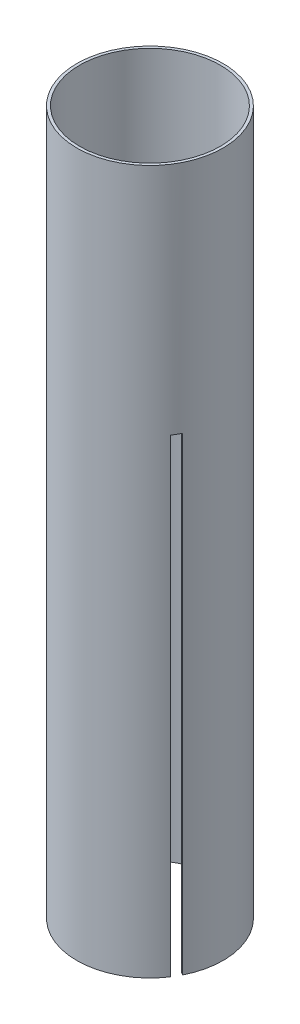
ISO-10303-21;
HEADER;
FILE_DESCRIPTION(('STEP AP214'),'2;1');
FILE_NAME('part.step','',(''),(''),'','','');
FILE_SCHEMA(('AUTOMOTIVE_DESIGN { 1 0 10303 214 1 1 1 1 }'));
ENDSEC;
DATA;
#1=APPLICATION_CONTEXT('core data for automotive mechanical design processes');
#2=APPLICATION_PROTOCOL_DEFINITION('international standard','automotive_design',2000,#1);
#3=PRODUCT_CONTEXT('',#1,'mechanical');
#4=PRODUCT('Part','Part','',(#3));
#5=PRODUCT_RELATED_PRODUCT_CATEGORY('part','',(#4));
#6=PRODUCT_DEFINITION_FORMATION('','',#4);
#7=PRODUCT_DEFINITION_CONTEXT('part definition',#1,'design');
#8=PRODUCT_DEFINITION('design','',#6,#7);
#9=PRODUCT_DEFINITION_SHAPE('','',#8);
#10=(LENGTH_UNIT() NAMED_UNIT(*) SI_UNIT(.MILLI.,.METRE.));
#11=(NAMED_UNIT(*) PLANE_ANGLE_UNIT() SI_UNIT($,.RADIAN.));
#12=(NAMED_UNIT(*) SI_UNIT($,.STERADIAN.) SOLID_ANGLE_UNIT());
#13=UNCERTAINTY_MEASURE_WITH_UNIT(LENGTH_MEASURE(1.E-05),#10,'distance_accuracy_value','');
#14=(GEOMETRIC_REPRESENTATION_CONTEXT(3) GLOBAL_UNCERTAINTY_ASSIGNED_CONTEXT((#13)) GLOBAL_UNIT_ASSIGNED_CONTEXT((#10,
#11,#12)) REPRESENTATION_CONTEXT('',''));
#15=CARTESIAN_POINT('',(0.,0.,0.));
#16=DIRECTION('',(0.,0.,1.));
#17=DIRECTION('',(1.,0.,0.));
#18=AXIS2_PLACEMENT_3D('',#15,#16,#17);
#19=CARTESIAN_POINT('',(0.,0.,0.));
#20=DIRECTION('',(0.,1.,0.));
#21=DIRECTION('',(0.,0.,1.));
#22=AXIS2_PLACEMENT_3D('',#19,#20,#21);
#23=PLANE('',#22);
#24=CARTESIAN_POINT('',(0.,0.,0.));
#25=DIRECTION('',(0.,1.,0.));
#26=DIRECTION('',(0.,0.,1.));
#27=AXIS2_PLACEMENT_3D('',#24,#25,#26);
#28=CIRCLE('',#27,38.1);
#29=CARTESIAN_POINT('',(-2.38125,0.,-38.0255131252361));
#30=VERTEX_POINT('',#29);
#31=CARTESIAN_POINT('',(-34.121685358393,0.,16.9505335698565));
#32=VERTEX_POINT('',#31);
#33=EDGE_CURVE('E216',#30,#32,#28,.T.);
#34=ORIENTED_EDGE('',*,*,#33,.T.);
#35=DIRECTION('',(0.866025403784436,0.,-0.500000000000004));
#36=VECTOR('',#35,1.);
#37=CARTESIAN_POINT('',(-48.0663202997772,0.,25.0014723070159));
#38=LINE('',#37,#36);
#39=CARTESIAN_POINT('',(-35.4439937150347,0.,17.7139686555153));
#40=VERTEX_POINT('',#39);
#41=EDGE_CURVE('E302',#40,#32,#38,.T.);
#42=ORIENTED_EDGE('',*,*,#41,.F.);
#43=CARTESIAN_POINT('',(0.,0.,0.));
#44=DIRECTION('',(0.,1.,0.));
#45=DIRECTION('',(0.,0.,1.));
#46=AXIS2_PLACEMENT_3D('',#43,#44,#45);
#47=CIRCLE('',#46,39.624);
#48=CARTESIAN_POINT('',(-2.38125,0.,-39.5523832965537));
#49=VERTEX_POINT('',#48);
#50=EDGE_CURVE('E226',#49,#40,#47,.T.);
#51=ORIENTED_EDGE('',*,*,#50,.F.);
#52=DIRECTION('',(0.,0.,1.));
#53=VECTOR('',#52,1.);
#54=CARTESIAN_POINT('',(-2.38125,0.,-39.624));
#55=LINE('',#54,#53);
#56=EDGE_CURVE('E181',#49,#30,#55,.T.);
#57=ORIENTED_EDGE('',*,*,#56,.T.);
#58=EDGE_LOOP('',(#34,#42,#51,#57));
#59=FACE_BOUND('',#58,.T.);
#60=ADVANCED_FACE('F64',(#59),#23,.F.);
#61=CARTESIAN_POINT('',(-33.0627437150347,0.,21.8384146410387));
#62=VERTEX_POINT('',#61);
#63=CARTESIAN_POINT('',(33.062743715035,0.,21.8384146410382));
#64=VERTEX_POINT('',#63);
#65=EDGE_CURVE('E229',#62,#64,#47,.T.);
#66=ORIENTED_EDGE('',*,*,#65,.F.);
#67=DIRECTION('',(0.866025403784436,0.,-0.500000000000004));
#68=VECTOR('',#67,1.);
#69=CARTESIAN_POINT('',(-45.6850702997772,0.,29.1259182925392));
#70=LINE('',#69,#68);
#71=CARTESIAN_POINT('',(-31.7404353583929,0.,21.0749795553799));
#72=VERTEX_POINT('',#71);
#73=EDGE_CURVE('E289',#62,#72,#70,.T.);
#74=ORIENTED_EDGE('',*,*,#73,.T.);
#75=CARTESIAN_POINT('',(31.7404353583932,0.,21.0749795553794));
#76=VERTEX_POINT('',#75);
#77=EDGE_CURVE('E220',#72,#76,#28,.T.);
#78=ORIENTED_EDGE('',*,*,#77,.T.);
#79=DIRECTION('',(-0.866025403784443,0.,-0.499999999999992));
#80=VECTOR('',#79,1.);
#81=CARTESIAN_POINT('',(45.6850702997775,0.,29.1259182925385));
#82=LINE('',#81,#80);
#83=EDGE_CURVE('E290',#64,#76,#82,.T.);
#84=ORIENTED_EDGE('',*,*,#83,.F.);
#85=EDGE_LOOP('',(#66,#74,#78,#84));
#86=FACE_BOUND('',#85,.T.);
#87=ADVANCED_FACE('F288',(#86),#23,.F.);
#88=CARTESIAN_POINT('',(0.,381.,0.));
#89=DIRECTION('',(0.,1.,0.));
#90=DIRECTION('',(0.,0.,1.));
#91=AXIS2_PLACEMENT_3D('',#88,#89,#90);
#92=PLANE('',#91);
#93=CARTESIAN_POINT('',(0.,381.,0.));
#94=DIRECTION('',(0.,1.,0.));
#95=DIRECTION('',(0.,0.,1.));
#96=AXIS2_PLACEMENT_3D('',#93,#94,#95);
#97=CIRCLE('',#96,39.624);
#98=CARTESIAN_POINT('',(0.,381.,39.624));
#99=VERTEX_POINT('',#98);
#100=EDGE_CURVE('E221',#99,#99,#97,.T.);
#101=ORIENTED_EDGE('',*,*,#100,.T.);
#102=EDGE_LOOP('',(#101));
#103=FACE_BOUND('',#102,.T.);
#104=CARTESIAN_POINT('',(0.,381.,0.));
#105=DIRECTION('',(0.,1.,0.));
#106=DIRECTION('',(0.,0.,1.));
#107=AXIS2_PLACEMENT_3D('',#104,#105,#106);
#108=CIRCLE('',#107,38.1);
#109=CARTESIAN_POINT('',(0.,381.,38.1));
#110=VERTEX_POINT('',#109);
#111=EDGE_CURVE('E211',#110,#110,#108,.T.);
#112=ORIENTED_EDGE('',*,*,#111,.F.);
#113=EDGE_LOOP('',(#112));
#114=FACE_BOUND('',#113,.T.);
#115=ADVANCED_FACE('F334',(#103,#114),#92,.T.);
#116=CARTESIAN_POINT('',(35.443993715035,0.,17.7139686555148));
#117=VERTEX_POINT('',#116);
#118=CARTESIAN_POINT('',(2.38125,0.,-39.5523832965537));
#119=VERTEX_POINT('',#118);
#120=EDGE_CURVE('E215',#117,#119,#47,.T.);
#121=ORIENTED_EDGE('',*,*,#120,.F.);
#122=DIRECTION('',(-0.866025403784443,0.,-0.499999999999992));
#123=VECTOR('',#122,1.);
#124=CARTESIAN_POINT('',(48.0663202997774,0.,25.0014723070151));
#125=LINE('',#124,#123);
#126=CARTESIAN_POINT('',(34.1216853583932,0.,16.950533569856));
#127=VERTEX_POINT('',#126);
#128=EDGE_CURVE('E154',#117,#127,#125,.T.);
#129=ORIENTED_EDGE('',*,*,#128,.T.);
#130=CARTESIAN_POINT('',(2.38125,0.,-38.0255131252361));
#131=VERTEX_POINT('',#130);
#132=EDGE_CURVE('E210',#127,#131,#28,.T.);
#133=ORIENTED_EDGE('',*,*,#132,.T.);
#134=DIRECTION('',(0.,0.,1.));
#135=VECTOR('',#134,1.);
#136=CARTESIAN_POINT('',(2.38125,0.,-39.624));
#137=LINE('',#136,#135);
#138=EDGE_CURVE('E193',#119,#131,#137,.T.);
#139=ORIENTED_EDGE('',*,*,#138,.F.);
#140=EDGE_LOOP('',(#121,#129,#133,#139));
#141=FACE_BOUND('',#140,.T.);
#142=ADVANCED_FACE('F270',(#141),#23,.F.);
#143=CARTESIAN_POINT('',(0.,381.,0.));
#144=DIRECTION('',(0.,-1.,0.));
#145=DIRECTION('',(0.,0.,-1.));
#146=AXIS2_PLACEMENT_3D('',#143,#144,#145);
#147=CYLINDRICAL_SURFACE('',#146,39.624);
#148=ORIENTED_EDGE('',*,*,#100,.F.);
#149=EDGE_LOOP('',(#148));
#150=FACE_BOUND('',#149,.T.);
#151=ORIENTED_EDGE('',*,*,#50,.T.);
#152=DIRECTION('',(0.,-1.,0.));
#153=VECTOR('',#152,1.);
#154=CARTESIAN_POINT('',(-35.4439937150347,381.,17.7139686555154));
#155=LINE('',#154,#153);
#156=CARTESIAN_POINT('',(-35.4439937150347,254.,17.7139686555154));
#157=VERTEX_POINT('',#156);
#158=EDGE_CURVE('E184',#40,#157,#155,.F.);
#159=ORIENTED_EDGE('',*,*,#158,.T.);
#160=CARTESIAN_POINT('',(0.,254.,0.));
#161=DIRECTION('',(0.,1.,0.));
#162=DIRECTION('',(0.,0.,1.));
#163=AXIS2_PLACEMENT_3D('',#160,#161,#162);
#164=CIRCLE('',#163,39.624);
#165=CARTESIAN_POINT('',(-33.0627437150347,254.,21.8384146410387));
#166=VERTEX_POINT('',#165);
#167=EDGE_CURVE('E177',#157,#166,#164,.T.);
#168=ORIENTED_EDGE('',*,*,#167,.T.);
#169=DIRECTION('',(0.,-1.,0.));
#170=VECTOR('',#169,1.);
#171=CARTESIAN_POINT('',(-33.0627437150347,381.,21.8384146410387));
#172=LINE('',#171,#170);
#173=EDGE_CURVE('E287',#166,#62,#172,.T.);
#174=ORIENTED_EDGE('',*,*,#173,.T.);
#175=ORIENTED_EDGE('',*,*,#65,.T.);
#176=DIRECTION('',(0.,-1.,0.));
#177=VECTOR('',#176,1.);
#178=CARTESIAN_POINT('',(33.062743715035,381.,21.8384146410382));
#179=LINE('',#178,#177);
#180=CARTESIAN_POINT('',(33.062743715035,254.,21.8384146410382));
#181=VERTEX_POINT('',#180);
#182=EDGE_CURVE('E159',#64,#181,#179,.F.);
#183=ORIENTED_EDGE('',*,*,#182,.T.);
#184=CARTESIAN_POINT('',(35.443993715035,254.,17.7139686555148));
#185=VERTEX_POINT('',#184);
#186=EDGE_CURVE('E165',#181,#185,#164,.T.);
#187=ORIENTED_EDGE('',*,*,#186,.T.);
#188=DIRECTION('',(0.,-1.,0.));
#189=VECTOR('',#188,1.);
#190=CARTESIAN_POINT('',(35.443993715035,381.,17.7139686555148));
#191=LINE('',#190,#189);
#192=EDGE_CURVE('E151',#185,#117,#191,.T.);
#193=ORIENTED_EDGE('',*,*,#192,.T.);
#194=ORIENTED_EDGE('',*,*,#120,.T.);
#195=DIRECTION('',(0.,-1.,0.));
#196=VECTOR('',#195,1.);
#197=CARTESIAN_POINT('',(2.38124999999992,381.,-39.5523832965537));
#198=LINE('',#197,#196);
#199=CARTESIAN_POINT('',(2.38124999999995,254.,-39.5523832965537));
#200=VERTEX_POINT('',#199);
#201=EDGE_CURVE('E203',#119,#200,#198,.F.);
#202=ORIENTED_EDGE('',*,*,#201,.T.);
#203=CARTESIAN_POINT('',(0.,254.,0.));
#204=DIRECTION('',(0.,1.,0.));
#205=DIRECTION('',(0.,0.,1.));
#206=AXIS2_PLACEMENT_3D('',#203,#204,#205);
#207=CIRCLE('',#206,39.624);
#208=CARTESIAN_POINT('',(-2.38125000000004,254.,-39.5523832965537));
#209=VERTEX_POINT('',#208);
#210=EDGE_CURVE('E207',#200,#209,#207,.T.);
#211=ORIENTED_EDGE('',*,*,#210,.T.);
#212=DIRECTION('',(0.,-1.,0.));
#213=VECTOR('',#212,1.);
#214=CARTESIAN_POINT('',(-2.38125000000006,381.,-39.5523832965537));
#215=LINE('',#214,#213);
#216=EDGE_CURVE('E192',#209,#49,#215,.T.);
#217=ORIENTED_EDGE('',*,*,#216,.T.);
#218=EDGE_LOOP('',(#151,#159,#168,#174,#175,#183,#187,#193,#194,#202,#211,#217));
#219=FACE_BOUND('',#218,.T.);
#220=ADVANCED_FACE('F66',(#150,#219),#147,.T.);
#221=CARTESIAN_POINT('',(0.,381.,0.));
#222=DIRECTION('',(0.,-1.,0.));
#223=DIRECTION('',(0.,0.,-1.));
#224=AXIS2_PLACEMENT_3D('',#221,#222,#223);
#225=CYLINDRICAL_SURFACE('',#224,38.1);
#226=DIRECTION('',(0.,-1.,0.));
#227=VECTOR('',#226,1.);
#228=CARTESIAN_POINT('',(-34.1216853583929,381.,16.9505335698566));
#229=LINE('',#228,#227);
#230=CARTESIAN_POINT('',(-34.1216853583929,254.,16.9505335698565));
#231=VERTEX_POINT('',#230);
#232=EDGE_CURVE('E12',#32,#231,#229,.F.);
#233=ORIENTED_EDGE('',*,*,#232,.F.);
#234=ORIENTED_EDGE('',*,*,#33,.F.);
#235=DIRECTION('',(0.,-1.,0.));
#236=VECTOR('',#235,1.);
#237=CARTESIAN_POINT('',(-2.38125000000006,381.,-38.0255131252361));
#238=LINE('',#237,#236);
#239=CARTESIAN_POINT('',(-2.38125000000006,254.,-38.0255131252361));
#240=VERTEX_POINT('',#239);
#241=EDGE_CURVE('E225',#240,#30,#238,.T.);
#242=ORIENTED_EDGE('',*,*,#241,.F.);
#243=CARTESIAN_POINT('',(0.,254.,0.));
#244=DIRECTION('',(0.,1.,0.));
#245=DIRECTION('',(0.,0.,1.));
#246=AXIS2_PLACEMENT_3D('',#243,#244,#245);
#247=CIRCLE('',#246,38.1);
#248=CARTESIAN_POINT('',(2.38124999999995,254.,-38.0255131252361));
#249=VERTEX_POINT('',#248);
#250=EDGE_CURVE('E232',#249,#240,#247,.T.);
#251=ORIENTED_EDGE('',*,*,#250,.F.);
#252=DIRECTION('',(0.,-1.,0.));
#253=VECTOR('',#252,1.);
#254=CARTESIAN_POINT('',(2.38124999999992,381.,-38.0255131252361));
#255=LINE('',#254,#253);
#256=EDGE_CURVE('E236',#131,#249,#255,.F.);
#257=ORIENTED_EDGE('',*,*,#256,.F.);
#258=ORIENTED_EDGE('',*,*,#132,.F.);
#259=DIRECTION('',(0.,-1.,0.));
#260=VECTOR('',#259,1.);
#261=CARTESIAN_POINT('',(34.1216853583932,381.,16.950533569856));
#262=LINE('',#261,#260);
#263=CARTESIAN_POINT('',(34.1216853583932,254.,16.950533569856));
#264=VERTEX_POINT('',#263);
#265=EDGE_CURVE('E239',#264,#127,#262,.T.);
#266=ORIENTED_EDGE('',*,*,#265,.F.);
#267=CARTESIAN_POINT('',(0.,254.,0.));
#268=DIRECTION('',(0.,1.,0.));
#269=DIRECTION('',(0.,0.,1.));
#270=AXIS2_PLACEMENT_3D('',#267,#268,#269);
#271=CIRCLE('',#270,38.1);
#272=CARTESIAN_POINT('',(31.7404353583933,254.,21.0749795553794));
#273=VERTEX_POINT('',#272);
#274=EDGE_CURVE('E168',#273,#264,#271,.T.);
#275=ORIENTED_EDGE('',*,*,#274,.F.);
#276=DIRECTION('',(0.,-1.,0.));
#277=VECTOR('',#276,1.);
#278=CARTESIAN_POINT('',(31.7404353583933,381.,21.0749795553794));
#279=LINE('',#278,#277);
#280=EDGE_CURVE('E244',#76,#273,#279,.F.);
#281=ORIENTED_EDGE('',*,*,#280,.F.);
#282=ORIENTED_EDGE('',*,*,#77,.F.);
#283=DIRECTION('',(0.,-1.,0.));
#284=VECTOR('',#283,1.);
#285=CARTESIAN_POINT('',(-31.7404353583929,381.,21.0749795553799));
#286=LINE('',#285,#284);
#287=CARTESIAN_POINT('',(-31.7404353583929,254.,21.0749795553799));
#288=VERTEX_POINT('',#287);
#289=EDGE_CURVE('E246',#288,#72,#286,.T.);
#290=ORIENTED_EDGE('',*,*,#289,.F.);
#291=EDGE_CURVE('E73',#231,#288,#271,.T.);
#292=ORIENTED_EDGE('',*,*,#291,.F.);
#293=EDGE_LOOP('',(#233,#234,#242,#251,#257,#258,#266,#275,#281,#282,#290,#292));
#294=FACE_BOUND('',#293,.T.);
#295=ORIENTED_EDGE('',*,*,#111,.T.);
#296=EDGE_LOOP('',(#295));
#297=FACE_BOUND('',#296,.T.);
#298=ADVANCED_FACE('F259',(#294,#297),#225,.F.);
#299=CARTESIAN_POINT('',(0.,254.,-39.624));
#300=DIRECTION('',(0.,1.,0.));
#301=DIRECTION('',(0.,0.,1.));
#302=AXIS2_PLACEMENT_3D('',#299,#300,#301);
#303=PLANE('',#302);
#304=DIRECTION('',(0.,0.,1.));
#305=VECTOR('',#304,1.);
#306=CARTESIAN_POINT('',(2.38124999999995,254.,-39.624));
#307=LINE('',#306,#305);
#308=EDGE_CURVE('E188',#200,#249,#307,.T.);
#309=ORIENTED_EDGE('',*,*,#308,.T.);
#310=ORIENTED_EDGE('',*,*,#250,.T.);
#311=DIRECTION('',(0.,0.,1.));
#312=VECTOR('',#311,1.);
#313=CARTESIAN_POINT('',(-2.38125000000004,254.,-39.624));
#314=LINE('',#313,#312);
#315=EDGE_CURVE('E176',#209,#240,#314,.T.);
#316=ORIENTED_EDGE('',*,*,#315,.F.);
#317=ORIENTED_EDGE('',*,*,#210,.F.);
#318=EDGE_LOOP('',(#309,#310,#316,#317));
#319=FACE_BOUND('',#318,.T.);
#320=ADVANCED_FACE('F281',(#319),#303,.F.);
#321=CARTESIAN_POINT('',(2.38125,0.,-39.624));
#322=DIRECTION('',(1.,0.,0.));
#323=DIRECTION('',(0.,1.,0.));
#324=AXIS2_PLACEMENT_3D('',#321,#322,#323);
#325=PLANE('',#324);
#326=ORIENTED_EDGE('',*,*,#138,.T.);
#327=ORIENTED_EDGE('',*,*,#256,.T.);
#328=ORIENTED_EDGE('',*,*,#308,.F.);
#329=ORIENTED_EDGE('',*,*,#201,.F.);
#330=EDGE_LOOP('',(#326,#327,#328,#329));
#331=FACE_BOUND('',#330,.T.);
#332=ADVANCED_FACE('F274',(#331),#325,.F.);
#333=CARTESIAN_POINT('',(-2.38125,0.,-39.624));
#334=DIRECTION('',(-1.,0.,0.));
#335=DIRECTION('',(0.,-1.,0.));
#336=AXIS2_PLACEMENT_3D('',#333,#334,#335);
#337=PLANE('',#336);
#338=ORIENTED_EDGE('',*,*,#315,.T.);
#339=ORIENTED_EDGE('',*,*,#241,.T.);
#340=ORIENTED_EDGE('',*,*,#56,.F.);
#341=ORIENTED_EDGE('',*,*,#216,.F.);
#342=EDGE_LOOP('',(#338,#339,#340,#341));
#343=FACE_BOUND('',#342,.T.);
#344=ADVANCED_FACE('F319',(#343),#337,.F.);
#345=CARTESIAN_POINT('',(48.0663202997774,0.,25.0014723070151));
#346=DIRECTION('',(0.499999999999992,0.,-0.866025403784443));
#347=DIRECTION('',(-0.866025403784443,0.,-0.499999999999992));
#348=AXIS2_PLACEMENT_3D('',#345,#346,#347);
#349=PLANE('',#348);
#350=DIRECTION('',(-0.866025403784443,0.,-0.499999999999992));
#351=VECTOR('',#350,1.);
#352=CARTESIAN_POINT('',(48.0663202997774,254.,25.0014723070151));
#353=LINE('',#352,#351);
#354=EDGE_CURVE('E88',#185,#264,#353,.T.);
#355=ORIENTED_EDGE('',*,*,#354,.T.);
#356=ORIENTED_EDGE('',*,*,#265,.T.);
#357=ORIENTED_EDGE('',*,*,#128,.F.);
#358=ORIENTED_EDGE('',*,*,#192,.F.);
#359=EDGE_LOOP('',(#355,#356,#357,#358));
#360=FACE_BOUND('',#359,.T.);
#361=ADVANCED_FACE('F152',(#360),#349,.F.);
#362=CARTESIAN_POINT('',(45.6850702997775,0.,29.1259182925385));
#363=DIRECTION('',(-0.499999999999992,0.,0.866025403784443));
#364=DIRECTION('',(0.866025403784443,0.,0.499999999999992));
#365=AXIS2_PLACEMENT_3D('',#362,#363,#364);
#366=PLANE('',#365);
#367=ORIENTED_EDGE('',*,*,#83,.T.);
#368=ORIENTED_EDGE('',*,*,#280,.T.);
#369=DIRECTION('',(-0.866025403784443,0.,-0.499999999999992));
#370=VECTOR('',#369,1.);
#371=CARTESIAN_POINT('',(45.6850702997775,254.,29.1259182925385));
#372=LINE('',#371,#370);
#373=EDGE_CURVE('E293',#181,#273,#372,.T.);
#374=ORIENTED_EDGE('',*,*,#373,.F.);
#375=ORIENTED_EDGE('',*,*,#182,.F.);
#376=EDGE_LOOP('',(#367,#368,#374,#375));
#377=FACE_BOUND('',#376,.T.);
#378=ADVANCED_FACE('F327',(#377),#366,.F.);
#379=CARTESIAN_POINT('',(-46.8756952997772,254.,27.0636952997775));
#380=DIRECTION('',(0.,1.,0.));
#381=DIRECTION('',(0.,0.,1.));
#382=AXIS2_PLACEMENT_3D('',#379,#380,#381);
#383=PLANE('',#382);
#384=ORIENTED_EDGE('',*,*,#373,.T.);
#385=ORIENTED_EDGE('',*,*,#274,.T.);
#386=ORIENTED_EDGE('',*,*,#354,.F.);
#387=ORIENTED_EDGE('',*,*,#186,.F.);
#388=EDGE_LOOP('',(#384,#385,#386,#387));
#389=FACE_BOUND('',#388,.T.);
#390=ADVANCED_FACE('F164',(#389),#383,.F.);
#391=DIRECTION('',(0.866025403784436,0.,-0.500000000000004));
#392=VECTOR('',#391,1.);
#393=CARTESIAN_POINT('',(-48.0663202997772,254.,25.0014723070159));
#394=LINE('',#393,#392);
#395=EDGE_CURVE('E160',#157,#231,#394,.T.);
#396=ORIENTED_EDGE('',*,*,#395,.T.);
#397=ORIENTED_EDGE('',*,*,#291,.T.);
#398=DIRECTION('',(0.866025403784436,0.,-0.500000000000004));
#399=VECTOR('',#398,1.);
#400=CARTESIAN_POINT('',(-45.6850702997772,254.,29.1259182925393));
#401=LINE('',#400,#399);
#402=EDGE_CURVE('E80',#166,#288,#401,.T.);
#403=ORIENTED_EDGE('',*,*,#402,.F.);
#404=ORIENTED_EDGE('',*,*,#167,.F.);
#405=EDGE_LOOP('',(#396,#397,#403,#404));
#406=FACE_BOUND('',#405,.T.);
#407=ADVANCED_FACE('F254',(#406),#383,.F.);
#408=CARTESIAN_POINT('',(-48.0663202997772,0.,25.0014723070159));
#409=DIRECTION('',(-0.500000000000004,0.,-0.866025403784436));
#410=DIRECTION('',(-0.866025403784436,0.,0.500000000000004));
#411=AXIS2_PLACEMENT_3D('',#408,#409,#410);
#412=PLANE('',#411);
#413=ORIENTED_EDGE('',*,*,#41,.T.);
#414=ORIENTED_EDGE('',*,*,#232,.T.);
#415=ORIENTED_EDGE('',*,*,#395,.F.);
#416=ORIENTED_EDGE('',*,*,#158,.F.);
#417=EDGE_LOOP('',(#413,#414,#415,#416));
#418=FACE_BOUND('',#417,.T.);
#419=ADVANCED_FACE('F316',(#418),#412,.F.);
#420=CARTESIAN_POINT('',(-45.6850702997772,0.,29.1259182925392));
#421=DIRECTION('',(0.500000000000004,0.,0.866025403784436));
#422=DIRECTION('',(0.866025403784436,0.,-0.500000000000004));
#423=AXIS2_PLACEMENT_3D('',#420,#421,#422);
#424=PLANE('',#423);
#425=ORIENTED_EDGE('',*,*,#402,.T.);
#426=ORIENTED_EDGE('',*,*,#289,.T.);
#427=ORIENTED_EDGE('',*,*,#73,.F.);
#428=ORIENTED_EDGE('',*,*,#173,.F.);
#429=EDGE_LOOP('',(#425,#426,#427,#428));
#430=FACE_BOUND('',#429,.T.);
#431=ADVANCED_FACE('F415',(#430),#424,.F.);
#432=CLOSED_SHELL('',(#60,#87,#115,#142,#220,#298,#320,#332,#344,#361,#378,#390,#407,#419,#431));
#433=MANIFOLD_SOLID_BREP('B2',#432);
#434=ADVANCED_BREP_SHAPE_REPRESENTATION('',(#18,#433),#14);
#435=SHAPE_DEFINITION_REPRESENTATION(#9,#434);
ENDSEC;
END-ISO-10303-21;
